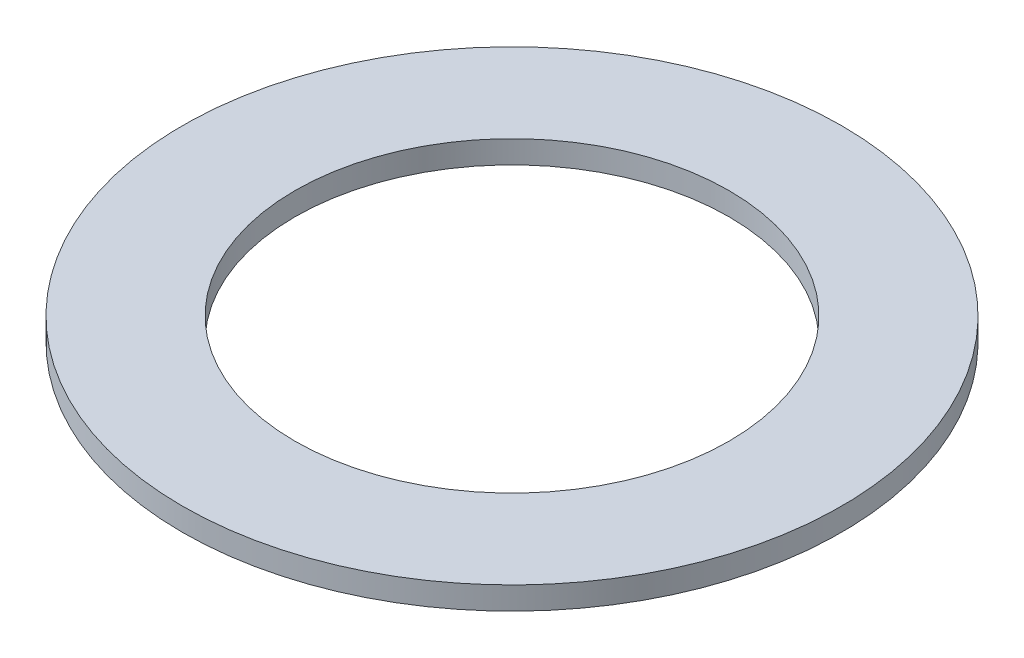
ISO-10303-21;
HEADER;
FILE_DESCRIPTION(('STEP AP214'),'2;1');
FILE_NAME('part.step','',(''),(''),'','','');
FILE_SCHEMA(('AUTOMOTIVE_DESIGN { 1 0 10303 214 1 1 1 1 }'));
ENDSEC;
DATA;
#1=APPLICATION_CONTEXT('core data for automotive mechanical design processes');
#2=APPLICATION_PROTOCOL_DEFINITION('international standard','automotive_design',2000,#1);
#3=PRODUCT_CONTEXT('',#1,'mechanical');
#4=PRODUCT('Part','Part','',(#3));
#5=PRODUCT_RELATED_PRODUCT_CATEGORY('part','',(#4));
#6=PRODUCT_DEFINITION_FORMATION('','',#4);
#7=PRODUCT_DEFINITION_CONTEXT('part definition',#1,'design');
#8=PRODUCT_DEFINITION('design','',#6,#7);
#9=PRODUCT_DEFINITION_SHAPE('','',#8);
#10=(LENGTH_UNIT() NAMED_UNIT(*) SI_UNIT(.MILLI.,.METRE.));
#11=(NAMED_UNIT(*) PLANE_ANGLE_UNIT() SI_UNIT($,.RADIAN.));
#12=(NAMED_UNIT(*) SI_UNIT($,.STERADIAN.) SOLID_ANGLE_UNIT());
#13=UNCERTAINTY_MEASURE_WITH_UNIT(LENGTH_MEASURE(1.E-05),#10,'distance_accuracy_value','');
#14=(GEOMETRIC_REPRESENTATION_CONTEXT(3) GLOBAL_UNCERTAINTY_ASSIGNED_CONTEXT((#13)) GLOBAL_UNIT_ASSIGNED_CONTEXT((#10,
#11,#12)) REPRESENTATION_CONTEXT('',''));
#15=CARTESIAN_POINT('',(0.,0.,0.));
#16=DIRECTION('',(0.,0.,1.));
#17=DIRECTION('',(1.,0.,0.));
#18=AXIS2_PLACEMENT_3D('',#15,#16,#17);
#19=CARTESIAN_POINT('',(0.,1.,0.));
#20=DIRECTION('',(0.,1.,0.));
#21=DIRECTION('',(0.,0.,1.));
#22=AXIS2_PLACEMENT_3D('',#19,#20,#21);
#23=PLANE('',#22);
#24=CARTESIAN_POINT('',(0.,1.,0.));
#25=DIRECTION('',(0.,1.,0.));
#26=DIRECTION('',(0.,0.,1.));
#27=AXIS2_PLACEMENT_3D('',#24,#25,#26);
#28=CIRCLE('',#27,14.5);
#29=CARTESIAN_POINT('',(0.,1.,14.5));
#30=VERTEX_POINT('',#29);
#31=EDGE_CURVE('E10',#30,#30,#28,.T.);
#32=ORIENTED_EDGE('',*,*,#31,.T.);
#33=EDGE_LOOP('',(#32));
#34=FACE_BOUND('',#33,.T.);
#35=CARTESIAN_POINT('',(0.,1.,0.));
#36=DIRECTION('',(0.,1.,0.));
#37=DIRECTION('',(0.,0.,1.));
#38=AXIS2_PLACEMENT_3D('',#35,#36,#37);
#39=CIRCLE('',#38,9.55);
#40=CARTESIAN_POINT('',(0.,1.,9.55));
#41=VERTEX_POINT('',#40);
#42=EDGE_CURVE('E52',#41,#41,#39,.T.);
#43=ORIENTED_EDGE('',*,*,#42,.F.);
#44=EDGE_LOOP('',(#43));
#45=FACE_BOUND('',#44,.T.);
#46=ADVANCED_FACE('F41',(#34,#45),#23,.T.);
#47=CARTESIAN_POINT('',(0.,0.,0.));
#48=DIRECTION('',(0.,1.,0.));
#49=DIRECTION('',(0.,0.,1.));
#50=AXIS2_PLACEMENT_3D('',#47,#48,#49);
#51=PLANE('',#50);
#52=CARTESIAN_POINT('',(0.,0.,0.));
#53=DIRECTION('',(0.,1.,0.));
#54=DIRECTION('',(0.,0.,1.));
#55=AXIS2_PLACEMENT_3D('',#52,#53,#54);
#56=CIRCLE('',#55,14.5);
#57=CARTESIAN_POINT('',(0.,0.,14.5));
#58=VERTEX_POINT('',#57);
#59=EDGE_CURVE('E45',#58,#58,#56,.T.);
#60=ORIENTED_EDGE('',*,*,#59,.F.);
#61=EDGE_LOOP('',(#60));
#62=FACE_BOUND('',#61,.T.);
#63=CARTESIAN_POINT('',(0.,0.,0.));
#64=DIRECTION('',(0.,1.,0.));
#65=DIRECTION('',(0.,0.,1.));
#66=AXIS2_PLACEMENT_3D('',#63,#64,#65);
#67=CIRCLE('',#66,9.55);
#68=CARTESIAN_POINT('',(0.,0.,9.55));
#69=VERTEX_POINT('',#68);
#70=EDGE_CURVE('E54',#69,#69,#67,.T.);
#71=ORIENTED_EDGE('',*,*,#70,.T.);
#72=EDGE_LOOP('',(#71));
#73=FACE_BOUND('',#72,.T.);
#74=ADVANCED_FACE('F64',(#62,#73),#51,.F.);
#75=CARTESIAN_POINT('',(0.,1.,0.));
#76=DIRECTION('',(0.,-1.,0.));
#77=DIRECTION('',(0.,0.,-1.));
#78=AXIS2_PLACEMENT_3D('',#75,#76,#77);
#79=CYLINDRICAL_SURFACE('',#78,14.5);
#80=ORIENTED_EDGE('',*,*,#31,.F.);
#81=EDGE_LOOP('',(#80));
#82=FACE_BOUND('',#81,.T.);
#83=ORIENTED_EDGE('',*,*,#59,.T.);
#84=EDGE_LOOP('',(#83));
#85=FACE_BOUND('',#84,.T.);
#86=ADVANCED_FACE('F43',(#82,#85),#79,.T.);
#87=CARTESIAN_POINT('',(0.,1.,0.));
#88=DIRECTION('',(0.,-1.,0.));
#89=DIRECTION('',(0.,0.,-1.));
#90=AXIS2_PLACEMENT_3D('',#87,#88,#89);
#91=CYLINDRICAL_SURFACE('',#90,9.55);
#92=ORIENTED_EDGE('',*,*,#42,.T.);
#93=EDGE_LOOP('',(#92));
#94=FACE_BOUND('',#93,.T.);
#95=ORIENTED_EDGE('',*,*,#70,.F.);
#96=EDGE_LOOP('',(#95));
#97=FACE_BOUND('',#96,.T.);
#98=ADVANCED_FACE('F60',(#94,#97),#91,.F.);
#99=CLOSED_SHELL('',(#46,#74,#86,#98));
#100=MANIFOLD_SOLID_BREP('B2',#99);
#101=ADVANCED_BREP_SHAPE_REPRESENTATION('',(#18,#100),#14);
#102=SHAPE_DEFINITION_REPRESENTATION(#9,#101);
ENDSEC;
END-ISO-10303-21;
